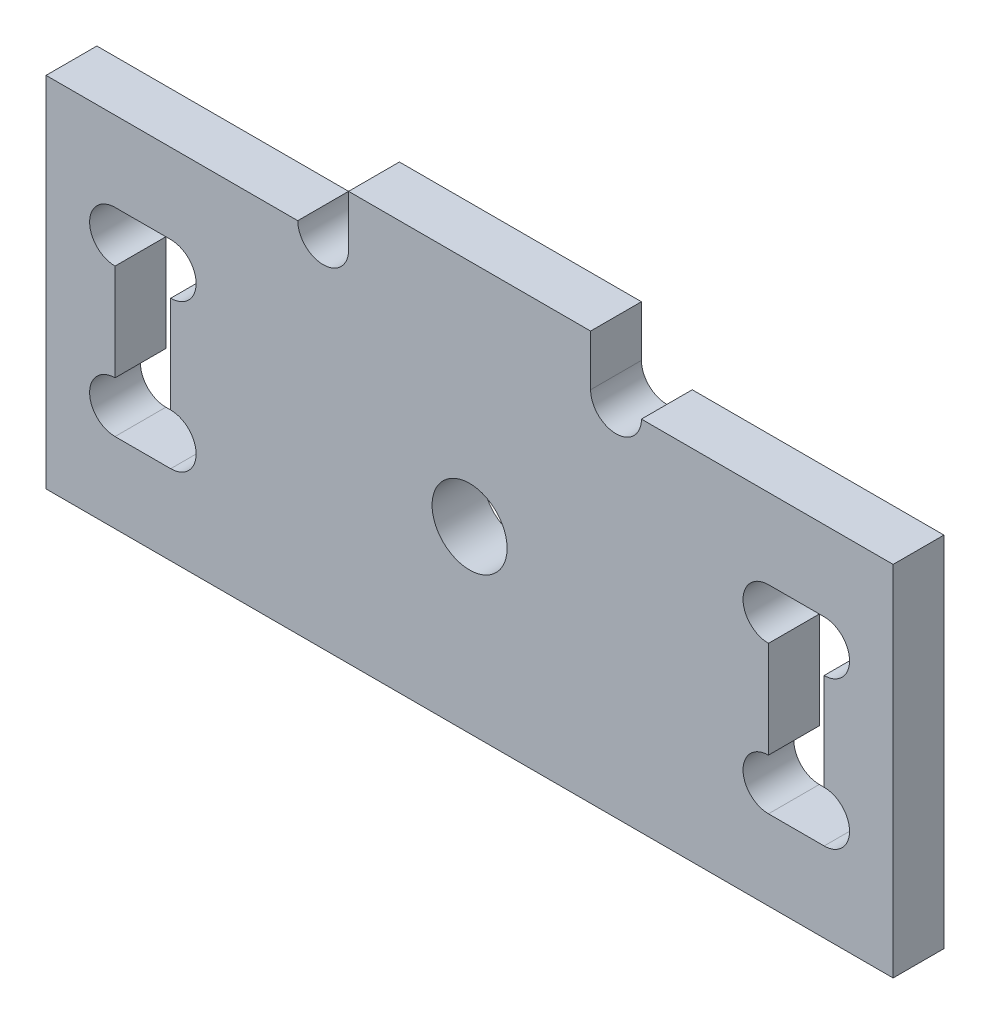
ISO-10303-21;
HEADER;
FILE_DESCRIPTION(('STEP AP214'),'2;1');
FILE_NAME('part.step','',(''),(''),'','','');
FILE_SCHEMA(('AUTOMOTIVE_DESIGN { 1 0 10303 214 1 1 1 1 }'));
ENDSEC;
DATA;
#1=APPLICATION_CONTEXT('core data for automotive mechanical design processes');
#2=APPLICATION_PROTOCOL_DEFINITION('international standard','automotive_design',2000,#1);
#3=PRODUCT_CONTEXT('',#1,'mechanical');
#4=PRODUCT('Part','Part','',(#3));
#5=PRODUCT_RELATED_PRODUCT_CATEGORY('part','',(#4));
#6=PRODUCT_DEFINITION_FORMATION('','',#4);
#7=PRODUCT_DEFINITION_CONTEXT('part definition',#1,'design');
#8=PRODUCT_DEFINITION('design','',#6,#7);
#9=PRODUCT_DEFINITION_SHAPE('','',#8);
#10=(LENGTH_UNIT() NAMED_UNIT(*) SI_UNIT(.MILLI.,.METRE.));
#11=(NAMED_UNIT(*) PLANE_ANGLE_UNIT() SI_UNIT($,.RADIAN.));
#12=(NAMED_UNIT(*) SI_UNIT($,.STERADIAN.) SOLID_ANGLE_UNIT());
#13=UNCERTAINTY_MEASURE_WITH_UNIT(LENGTH_MEASURE(1.E-05),#10,'distance_accuracy_value','');
#14=(GEOMETRIC_REPRESENTATION_CONTEXT(3) GLOBAL_UNCERTAINTY_ASSIGNED_CONTEXT((#13)) GLOBAL_UNIT_ASSIGNED_CONTEXT((#10,
#11,#12)) REPRESENTATION_CONTEXT('',''));
#15=CARTESIAN_POINT('',(0.,0.,0.));
#16=DIRECTION('',(0.,0.,1.));
#17=DIRECTION('',(1.,0.,0.));
#18=AXIS2_PLACEMENT_3D('',#15,#16,#17);
#19=CARTESIAN_POINT('',(12.35,0.,2.1));
#20=DIRECTION('',(-1.,0.,0.));
#21=DIRECTION('',(0.,0.,1.));
#22=AXIS2_PLACEMENT_3D('',#19,#20,#21);
#23=PLANE('',#22);
#24=DIRECTION('',(0.,1.,0.));
#25=VECTOR('',#24,1.);
#26=CARTESIAN_POINT('',(12.35,0.,0.));
#27=LINE('',#26,#25);
#28=CARTESIAN_POINT('',(12.35,-2.,0.));
#29=VERTEX_POINT('',#28);
#30=CARTESIAN_POINT('',(12.35,2.,0.));
#31=VERTEX_POINT('',#30);
#32=EDGE_CURVE('E299',#29,#31,#27,.T.);
#33=ORIENTED_EDGE('',*,*,#32,.T.);
#34=DIRECTION('',(0.,0.,-1.));
#35=VECTOR('',#34,1.);
#36=CARTESIAN_POINT('',(12.35,2.,2.1));
#37=LINE('',#36,#35);
#38=CARTESIAN_POINT('',(12.35,2.,2.1));
#39=VERTEX_POINT('',#38);
#40=EDGE_CURVE('E11',#39,#31,#37,.T.);
#41=ORIENTED_EDGE('',*,*,#40,.F.);
#42=DIRECTION('',(0.,1.,0.));
#43=VECTOR('',#42,1.);
#44=CARTESIAN_POINT('',(12.35,0.,2.1));
#45=LINE('',#44,#43);
#46=CARTESIAN_POINT('',(12.35,-2.,2.1));
#47=VERTEX_POINT('',#46);
#48=EDGE_CURVE('E692',#47,#39,#45,.T.);
#49=ORIENTED_EDGE('',*,*,#48,.F.);
#50=DIRECTION('',(0.,0.,-1.));
#51=VECTOR('',#50,1.);
#52=CARTESIAN_POINT('',(12.35,-2.,2.1));
#53=LINE('',#52,#51);
#54=EDGE_CURVE('E317',#47,#29,#53,.T.);
#55=ORIENTED_EDGE('',*,*,#54,.T.);
#56=EDGE_LOOP('',(#33,#41,#49,#55));
#57=FACE_BOUND('',#56,.T.);
#58=ADVANCED_FACE('F36',(#57),#23,.F.);
#59=CARTESIAN_POINT('',(12.35,3.05,2.1));
#60=DIRECTION('',(0.,0.,-1.));
#61=DIRECTION('',(-1.,0.,0.));
#62=AXIS2_PLACEMENT_3D('',#59,#60,#61);
#63=CYLINDRICAL_SURFACE('',#62,1.05);
#64=CARTESIAN_POINT('',(12.35,3.05,0.));
#65=DIRECTION('',(0.,0.,1.));
#66=DIRECTION('',(1.,0.,0.));
#67=AXIS2_PLACEMENT_3D('',#64,#65,#66);
#68=CIRCLE('',#67,1.05);
#69=CARTESIAN_POINT('',(12.35,4.1,0.));
#70=VERTEX_POINT('',#69);
#71=EDGE_CURVE('E302',#31,#70,#68,.F.);
#72=ORIENTED_EDGE('',*,*,#71,.T.);
#73=DIRECTION('',(0.,0.,-1.));
#74=VECTOR('',#73,1.);
#75=CARTESIAN_POINT('',(12.35,4.1,2.1));
#76=LINE('',#75,#74);
#77=CARTESIAN_POINT('',(12.35,4.1,2.1));
#78=VERTEX_POINT('',#77);
#79=EDGE_CURVE('E46',#78,#70,#76,.T.);
#80=ORIENTED_EDGE('',*,*,#79,.F.);
#81=CARTESIAN_POINT('',(12.35,3.05,2.1));
#82=DIRECTION('',(0.,0.,1.));
#83=DIRECTION('',(1.,0.,0.));
#84=AXIS2_PLACEMENT_3D('',#81,#82,#83);
#85=CIRCLE('',#84,1.05);
#86=EDGE_CURVE('E690',#39,#78,#85,.F.);
#87=ORIENTED_EDGE('',*,*,#86,.F.);
#88=ORIENTED_EDGE('',*,*,#40,.T.);
#89=EDGE_LOOP('',(#72,#80,#87,#88));
#90=FACE_BOUND('',#89,.T.);
#91=ADVANCED_FACE('F425',(#90),#63,.F.);
#92=CARTESIAN_POINT('',(0.,4.1,2.1));
#93=DIRECTION('',(0.,1.,0.));
#94=DIRECTION('',(0.,0.,1.));
#95=AXIS2_PLACEMENT_3D('',#92,#93,#94);
#96=PLANE('',#95);
#97=DIRECTION('',(1.,0.,0.));
#98=VECTOR('',#97,1.);
#99=CARTESIAN_POINT('',(0.,4.1,0.));
#100=LINE('',#99,#98);
#101=CARTESIAN_POINT('',(14.65,4.1,0.));
#102=VERTEX_POINT('',#101);
#103=EDGE_CURVE('E304',#70,#102,#100,.T.);
#104=ORIENTED_EDGE('',*,*,#103,.T.);
#105=DIRECTION('',(0.,0.,-1.));
#106=VECTOR('',#105,1.);
#107=CARTESIAN_POINT('',(14.65,4.1,2.1));
#108=LINE('',#107,#106);
#109=CARTESIAN_POINT('',(14.65,4.1,2.1));
#110=VERTEX_POINT('',#109);
#111=EDGE_CURVE('E324',#110,#102,#108,.T.);
#112=ORIENTED_EDGE('',*,*,#111,.F.);
#113=DIRECTION('',(1.,0.,0.));
#114=VECTOR('',#113,1.);
#115=CARTESIAN_POINT('',(0.,4.1,2.1));
#116=LINE('',#115,#114);
#117=EDGE_CURVE('E686',#78,#110,#116,.T.);
#118=ORIENTED_EDGE('',*,*,#117,.F.);
#119=ORIENTED_EDGE('',*,*,#79,.T.);
#120=EDGE_LOOP('',(#104,#112,#118,#119));
#121=FACE_BOUND('',#120,.T.);
#122=ADVANCED_FACE('F431',(#121),#96,.F.);
#123=CARTESIAN_POINT('',(14.65,3.05,2.1));
#124=DIRECTION('',(0.,0.,-1.));
#125=DIRECTION('',(-1.,0.,0.));
#126=AXIS2_PLACEMENT_3D('',#123,#124,#125);
#127=CYLINDRICAL_SURFACE('',#126,1.05);
#128=CARTESIAN_POINT('',(14.65,3.05,0.));
#129=DIRECTION('',(0.,0.,1.));
#130=DIRECTION('',(1.,0.,0.));
#131=AXIS2_PLACEMENT_3D('',#128,#129,#130);
#132=CIRCLE('',#131,1.05);
#133=CARTESIAN_POINT('',(14.65,2.,0.));
#134=VERTEX_POINT('',#133);
#135=EDGE_CURVE('E306',#102,#134,#132,.F.);
#136=ORIENTED_EDGE('',*,*,#135,.T.);
#137=DIRECTION('',(0.,0.,-1.));
#138=VECTOR('',#137,1.);
#139=CARTESIAN_POINT('',(14.65,2.,2.1));
#140=LINE('',#139,#138);
#141=CARTESIAN_POINT('',(14.65,2.,2.1));
#142=VERTEX_POINT('',#141);
#143=EDGE_CURVE('E322',#142,#134,#140,.T.);
#144=ORIENTED_EDGE('',*,*,#143,.F.);
#145=CARTESIAN_POINT('',(14.65,3.05,2.1));
#146=DIRECTION('',(0.,0.,1.));
#147=DIRECTION('',(1.,0.,0.));
#148=AXIS2_PLACEMENT_3D('',#145,#146,#147);
#149=CIRCLE('',#148,1.05);
#150=EDGE_CURVE('E683',#110,#142,#149,.F.);
#151=ORIENTED_EDGE('',*,*,#150,.F.);
#152=ORIENTED_EDGE('',*,*,#111,.T.);
#153=EDGE_LOOP('',(#136,#144,#151,#152));
#154=FACE_BOUND('',#153,.T.);
#155=ADVANCED_FACE('F633',(#154),#127,.F.);
#156=CARTESIAN_POINT('',(14.65,0.,2.1));
#157=DIRECTION('',(-1.,0.,0.));
#158=DIRECTION('',(0.,0.,1.));
#159=AXIS2_PLACEMENT_3D('',#156,#157,#158);
#160=PLANE('',#159);
#161=DIRECTION('',(0.,1.,0.));
#162=VECTOR('',#161,1.);
#163=CARTESIAN_POINT('',(14.65,0.,0.));
#164=LINE('',#163,#162);
#165=CARTESIAN_POINT('',(14.65,-2.,0.));
#166=VERTEX_POINT('',#165);
#167=EDGE_CURVE('E309',#166,#134,#164,.T.);
#168=ORIENTED_EDGE('',*,*,#167,.F.);
#169=DIRECTION('',(0.,0.,-1.));
#170=VECTOR('',#169,1.);
#171=CARTESIAN_POINT('',(14.65,-2.,2.1));
#172=LINE('',#171,#170);
#173=CARTESIAN_POINT('',(14.65,-2.,2.1));
#174=VERTEX_POINT('',#173);
#175=EDGE_CURVE('E234',#174,#166,#172,.T.);
#176=ORIENTED_EDGE('',*,*,#175,.F.);
#177=DIRECTION('',(0.,1.,0.));
#178=VECTOR('',#177,1.);
#179=CARTESIAN_POINT('',(14.65,0.,2.1));
#180=LINE('',#179,#178);
#181=EDGE_CURVE('E223',#174,#142,#180,.T.);
#182=ORIENTED_EDGE('',*,*,#181,.T.);
#183=ORIENTED_EDGE('',*,*,#143,.T.);
#184=EDGE_LOOP('',(#168,#176,#182,#183));
#185=FACE_BOUND('',#184,.T.);
#186=ADVANCED_FACE('F625',(#185),#160,.T.);
#187=CARTESIAN_POINT('',(14.65,-3.05,2.1));
#188=DIRECTION('',(0.,0.,-1.));
#189=DIRECTION('',(-1.,0.,0.));
#190=AXIS2_PLACEMENT_3D('',#187,#188,#189);
#191=CYLINDRICAL_SURFACE('',#190,1.05);
#192=CARTESIAN_POINT('',(14.65,-3.05,0.));
#193=DIRECTION('',(0.,0.,1.));
#194=DIRECTION('',(1.,0.,0.));
#195=AXIS2_PLACEMENT_3D('',#192,#193,#194);
#196=CIRCLE('',#195,1.05);
#197=CARTESIAN_POINT('',(14.65,-4.1,0.));
#198=VERTEX_POINT('',#197);
#199=EDGE_CURVE('E230',#166,#198,#196,.F.);
#200=ORIENTED_EDGE('',*,*,#199,.T.);
#201=DIRECTION('',(0.,0.,-1.));
#202=VECTOR('',#201,1.);
#203=CARTESIAN_POINT('',(14.65,-4.1,2.1));
#204=LINE('',#203,#202);
#205=CARTESIAN_POINT('',(14.65,-4.1,2.1));
#206=VERTEX_POINT('',#205);
#207=EDGE_CURVE('E227',#206,#198,#204,.T.);
#208=ORIENTED_EDGE('',*,*,#207,.F.);
#209=CARTESIAN_POINT('',(14.65,-3.05,2.1));
#210=DIRECTION('',(0.,0.,1.));
#211=DIRECTION('',(1.,0.,0.));
#212=AXIS2_PLACEMENT_3D('',#209,#210,#211);
#213=CIRCLE('',#212,1.05);
#214=EDGE_CURVE('E217',#174,#206,#213,.F.);
#215=ORIENTED_EDGE('',*,*,#214,.F.);
#216=ORIENTED_EDGE('',*,*,#175,.T.);
#217=EDGE_LOOP('',(#200,#208,#215,#216));
#218=FACE_BOUND('',#217,.T.);
#219=ADVANCED_FACE('F228',(#218),#191,.F.);
#220=CARTESIAN_POINT('',(0.,-4.1,2.1));
#221=DIRECTION('',(0.,1.,0.));
#222=DIRECTION('',(0.,0.,1.));
#223=AXIS2_PLACEMENT_3D('',#220,#221,#222);
#224=PLANE('',#223);
#225=DIRECTION('',(1.,0.,0.));
#226=VECTOR('',#225,1.);
#227=CARTESIAN_POINT('',(0.,-4.1,0.));
#228=LINE('',#227,#226);
#229=CARTESIAN_POINT('',(12.35,-4.1,0.));
#230=VERTEX_POINT('',#229);
#231=EDGE_CURVE('E313',#230,#198,#228,.T.);
#232=ORIENTED_EDGE('',*,*,#231,.F.);
#233=DIRECTION('',(0.,0.,-1.));
#234=VECTOR('',#233,1.);
#235=CARTESIAN_POINT('',(12.35,-4.1,2.1));
#236=LINE('',#235,#234);
#237=CARTESIAN_POINT('',(12.35,-4.1,2.1));
#238=VERTEX_POINT('',#237);
#239=EDGE_CURVE('E137',#238,#230,#236,.T.);
#240=ORIENTED_EDGE('',*,*,#239,.F.);
#241=DIRECTION('',(1.,0.,0.));
#242=VECTOR('',#241,1.);
#243=CARTESIAN_POINT('',(0.,-4.1,2.1));
#244=LINE('',#243,#242);
#245=EDGE_CURVE('E221',#238,#206,#244,.T.);
#246=ORIENTED_EDGE('',*,*,#245,.T.);
#247=ORIENTED_EDGE('',*,*,#207,.T.);
#248=EDGE_LOOP('',(#232,#240,#246,#247));
#249=FACE_BOUND('',#248,.T.);
#250=ADVANCED_FACE('F236',(#249),#224,.T.);
#251=CARTESIAN_POINT('',(-12.35,-3.05,2.1));
#252=DIRECTION('',(0.,0.,-1.));
#253=DIRECTION('',(-1.,0.,0.));
#254=AXIS2_PLACEMENT_3D('',#251,#252,#253);
#255=CYLINDRICAL_SURFACE('',#254,1.05);
#256=CARTESIAN_POINT('',(-12.35,-3.05,0.));
#257=DIRECTION('',(0.,0.,1.));
#258=DIRECTION('',(1.,0.,0.));
#259=AXIS2_PLACEMENT_3D('',#256,#257,#258);
#260=CIRCLE('',#259,1.05);
#261=CARTESIAN_POINT('',(-12.35,-4.1,0.));
#262=VERTEX_POINT('',#261);
#263=CARTESIAN_POINT('',(-12.35,-2.,0.));
#264=VERTEX_POINT('',#263);
#265=EDGE_CURVE('E275',#262,#264,#260,.T.);
#266=ORIENTED_EDGE('',*,*,#265,.F.);
#267=DIRECTION('',(0.,0.,-1.));
#268=VECTOR('',#267,1.);
#269=CARTESIAN_POINT('',(-12.35,-4.1,2.1));
#270=LINE('',#269,#268);
#271=CARTESIAN_POINT('',(-12.35,-4.1,2.1));
#272=VERTEX_POINT('',#271);
#273=EDGE_CURVE('E319',#272,#262,#270,.T.);
#274=ORIENTED_EDGE('',*,*,#273,.F.);
#275=CARTESIAN_POINT('',(-12.35,-3.05,2.1));
#276=DIRECTION('',(0.,0.,1.));
#277=DIRECTION('',(1.,0.,0.));
#278=AXIS2_PLACEMENT_3D('',#275,#276,#277);
#279=CIRCLE('',#278,1.05);
#280=CARTESIAN_POINT('',(-12.35,-2.,2.1));
#281=VERTEX_POINT('',#280);
#282=EDGE_CURVE('E713',#272,#281,#279,.T.);
#283=ORIENTED_EDGE('',*,*,#282,.T.);
#284=DIRECTION('',(0.,0.,-1.));
#285=VECTOR('',#284,1.);
#286=CARTESIAN_POINT('',(-12.35,-2.,2.1));
#287=LINE('',#286,#285);
#288=EDGE_CURVE('E329',#281,#264,#287,.T.);
#289=ORIENTED_EDGE('',*,*,#288,.T.);
#290=EDGE_LOOP('',(#266,#274,#283,#289));
#291=FACE_BOUND('',#290,.T.);
#292=ADVANCED_FACE('F463',(#291),#255,.F.);
#293=CARTESIAN_POINT('',(0.,-4.1,2.1));
#294=DIRECTION('',(0.,-1.,0.));
#295=DIRECTION('',(0.,0.,-1.));
#296=AXIS2_PLACEMENT_3D('',#293,#294,#295);
#297=PLANE('',#296);
#298=DIRECTION('',(-1.,0.,0.));
#299=VECTOR('',#298,1.);
#300=CARTESIAN_POINT('',(0.,-4.1,0.));
#301=LINE('',#300,#299);
#302=CARTESIAN_POINT('',(-14.65,-4.1,0.));
#303=VERTEX_POINT('',#302);
#304=EDGE_CURVE('E278',#262,#303,#301,.T.);
#305=ORIENTED_EDGE('',*,*,#304,.T.);
#306=DIRECTION('',(0.,0.,-1.));
#307=VECTOR('',#306,1.);
#308=CARTESIAN_POINT('',(-14.65,-4.1,2.1));
#309=LINE('',#308,#307);
#310=CARTESIAN_POINT('',(-14.65,-4.1,2.1));
#311=VERTEX_POINT('',#310);
#312=EDGE_CURVE('E341',#311,#303,#309,.T.);
#313=ORIENTED_EDGE('',*,*,#312,.F.);
#314=DIRECTION('',(-1.,0.,0.));
#315=VECTOR('',#314,1.);
#316=CARTESIAN_POINT('',(0.,-4.1,2.1));
#317=LINE('',#316,#315);
#318=EDGE_CURVE('E711',#272,#311,#317,.T.);
#319=ORIENTED_EDGE('',*,*,#318,.F.);
#320=ORIENTED_EDGE('',*,*,#273,.T.);
#321=EDGE_LOOP('',(#305,#313,#319,#320));
#322=FACE_BOUND('',#321,.T.);
#323=ADVANCED_FACE('F459',(#322),#297,.F.);
#324=CARTESIAN_POINT('',(-14.65,-3.05,2.1));
#325=DIRECTION('',(0.,0.,-1.));
#326=DIRECTION('',(-1.,0.,0.));
#327=AXIS2_PLACEMENT_3D('',#324,#325,#326);
#328=CYLINDRICAL_SURFACE('',#327,1.05);
#329=CARTESIAN_POINT('',(-14.65,-3.05,0.));
#330=DIRECTION('',(0.,0.,1.));
#331=DIRECTION('',(1.,0.,0.));
#332=AXIS2_PLACEMENT_3D('',#329,#330,#331);
#333=CIRCLE('',#332,1.05);
#334=CARTESIAN_POINT('',(-14.65,-2.,0.));
#335=VERTEX_POINT('',#334);
#336=EDGE_CURVE('E281',#335,#303,#333,.T.);
#337=ORIENTED_EDGE('',*,*,#336,.F.);
#338=DIRECTION('',(0.,0.,-1.));
#339=VECTOR('',#338,1.);
#340=CARTESIAN_POINT('',(-14.65,-2.,2.1));
#341=LINE('',#340,#339);
#342=CARTESIAN_POINT('',(-14.65,-2.,2.1));
#343=VERTEX_POINT('',#342);
#344=EDGE_CURVE('E339',#343,#335,#341,.T.);
#345=ORIENTED_EDGE('',*,*,#344,.F.);
#346=CARTESIAN_POINT('',(-14.65,-3.05,2.1));
#347=DIRECTION('',(0.,0.,1.));
#348=DIRECTION('',(1.,0.,0.));
#349=AXIS2_PLACEMENT_3D('',#346,#347,#348);
#350=CIRCLE('',#349,1.05);
#351=EDGE_CURVE('E708',#343,#311,#350,.T.);
#352=ORIENTED_EDGE('',*,*,#351,.T.);
#353=ORIENTED_EDGE('',*,*,#312,.T.);
#354=EDGE_LOOP('',(#337,#345,#352,#353));
#355=FACE_BOUND('',#354,.T.);
#356=ADVANCED_FACE('F455',(#355),#328,.F.);
#357=CARTESIAN_POINT('',(-14.65,0.,2.1));
#358=DIRECTION('',(-1.,0.,0.));
#359=DIRECTION('',(0.,0.,1.));
#360=AXIS2_PLACEMENT_3D('',#357,#358,#359);
#361=PLANE('',#360);
#362=DIRECTION('',(0.,1.,0.));
#363=VECTOR('',#362,1.);
#364=CARTESIAN_POINT('',(-14.65,0.,0.));
#365=LINE('',#364,#363);
#366=CARTESIAN_POINT('',(-14.65,2.,0.));
#367=VERTEX_POINT('',#366);
#368=EDGE_CURVE('E284',#335,#367,#365,.T.);
#369=ORIENTED_EDGE('',*,*,#368,.T.);
#370=DIRECTION('',(0.,0.,-1.));
#371=VECTOR('',#370,1.);
#372=CARTESIAN_POINT('',(-14.65,2.,2.1));
#373=LINE('',#372,#371);
#374=CARTESIAN_POINT('',(-14.65,2.,2.1));
#375=VERTEX_POINT('',#374);
#376=EDGE_CURVE('E337',#375,#367,#373,.T.);
#377=ORIENTED_EDGE('',*,*,#376,.F.);
#378=DIRECTION('',(0.,1.,0.));
#379=VECTOR('',#378,1.);
#380=CARTESIAN_POINT('',(-14.65,0.,2.1));
#381=LINE('',#380,#379);
#382=EDGE_CURVE('E706',#343,#375,#381,.T.);
#383=ORIENTED_EDGE('',*,*,#382,.F.);
#384=ORIENTED_EDGE('',*,*,#344,.T.);
#385=EDGE_LOOP('',(#369,#377,#383,#384));
#386=FACE_BOUND('',#385,.T.);
#387=ADVANCED_FACE('F451',(#386),#361,.F.);
#388=CARTESIAN_POINT('',(-14.65,3.05,2.1));
#389=DIRECTION('',(0.,0.,-1.));
#390=DIRECTION('',(-1.,0.,0.));
#391=AXIS2_PLACEMENT_3D('',#388,#389,#390);
#392=CYLINDRICAL_SURFACE('',#391,1.05);
#393=CARTESIAN_POINT('',(-14.65,3.05,0.));
#394=DIRECTION('',(0.,0.,1.));
#395=DIRECTION('',(1.,0.,0.));
#396=AXIS2_PLACEMENT_3D('',#393,#394,#395);
#397=CIRCLE('',#396,1.05);
#398=CARTESIAN_POINT('',(-14.65,4.1,0.));
#399=VERTEX_POINT('',#398);
#400=EDGE_CURVE('E287',#399,#367,#397,.T.);
#401=ORIENTED_EDGE('',*,*,#400,.F.);
#402=DIRECTION('',(0.,0.,-1.));
#403=VECTOR('',#402,1.);
#404=CARTESIAN_POINT('',(-14.65,4.1,2.1));
#405=LINE('',#404,#403);
#406=CARTESIAN_POINT('',(-14.65,4.1,2.1));
#407=VERTEX_POINT('',#406);
#408=EDGE_CURVE('E335',#407,#399,#405,.T.);
#409=ORIENTED_EDGE('',*,*,#408,.F.);
#410=CARTESIAN_POINT('',(-14.65,3.05,2.1));
#411=DIRECTION('',(0.,0.,1.));
#412=DIRECTION('',(1.,0.,0.));
#413=AXIS2_PLACEMENT_3D('',#410,#411,#412);
#414=CIRCLE('',#413,1.05);
#415=EDGE_CURVE('E703',#407,#375,#414,.T.);
#416=ORIENTED_EDGE('',*,*,#415,.T.);
#417=ORIENTED_EDGE('',*,*,#376,.T.);
#418=EDGE_LOOP('',(#401,#409,#416,#417));
#419=FACE_BOUND('',#418,.T.);
#420=ADVANCED_FACE('F447',(#419),#392,.F.);
#421=CARTESIAN_POINT('',(0.,4.1,2.1));
#422=DIRECTION('',(0.,-1.,0.));
#423=DIRECTION('',(0.,0.,-1.));
#424=AXIS2_PLACEMENT_3D('',#421,#422,#423);
#425=PLANE('',#424);
#426=DIRECTION('',(-1.,0.,0.));
#427=VECTOR('',#426,1.);
#428=CARTESIAN_POINT('',(0.,4.1,0.));
#429=LINE('',#428,#427);
#430=CARTESIAN_POINT('',(-12.35,4.1,0.));
#431=VERTEX_POINT('',#430);
#432=EDGE_CURVE('E290',#431,#399,#429,.T.);
#433=ORIENTED_EDGE('',*,*,#432,.F.);
#434=DIRECTION('',(0.,0.,-1.));
#435=VECTOR('',#434,1.);
#436=CARTESIAN_POINT('',(-12.35,4.1,2.1));
#437=LINE('',#436,#435);
#438=CARTESIAN_POINT('',(-12.35,4.1,2.1));
#439=VERTEX_POINT('',#438);
#440=EDGE_CURVE('E333',#439,#431,#437,.T.);
#441=ORIENTED_EDGE('',*,*,#440,.F.);
#442=DIRECTION('',(-1.,0.,0.));
#443=VECTOR('',#442,1.);
#444=CARTESIAN_POINT('',(0.,4.1,2.1));
#445=LINE('',#444,#443);
#446=EDGE_CURVE('E700',#439,#407,#445,.T.);
#447=ORIENTED_EDGE('',*,*,#446,.T.);
#448=ORIENTED_EDGE('',*,*,#408,.T.);
#449=EDGE_LOOP('',(#433,#441,#447,#448));
#450=FACE_BOUND('',#449,.T.);
#451=ADVANCED_FACE('F443',(#450),#425,.T.);
#452=CARTESIAN_POINT('',(-12.35,3.05,2.1));
#453=DIRECTION('',(0.,0.,-1.));
#454=DIRECTION('',(-1.,0.,0.));
#455=AXIS2_PLACEMENT_3D('',#452,#453,#454);
#456=CYLINDRICAL_SURFACE('',#455,1.05);
#457=CARTESIAN_POINT('',(-12.35,3.05,0.));
#458=DIRECTION('',(0.,0.,1.));
#459=DIRECTION('',(1.,0.,0.));
#460=AXIS2_PLACEMENT_3D('',#457,#458,#459);
#461=CIRCLE('',#460,1.05);
#462=CARTESIAN_POINT('',(-12.35,2.,0.));
#463=VERTEX_POINT('',#462);
#464=EDGE_CURVE('E293',#463,#431,#461,.T.);
#465=ORIENTED_EDGE('',*,*,#464,.F.);
#466=DIRECTION('',(0.,0.,-1.));
#467=VECTOR('',#466,1.);
#468=CARTESIAN_POINT('',(-12.35,2.,2.1));
#469=LINE('',#468,#467);
#470=CARTESIAN_POINT('',(-12.35,2.,2.1));
#471=VERTEX_POINT('',#470);
#472=EDGE_CURVE('E331',#471,#463,#469,.T.);
#473=ORIENTED_EDGE('',*,*,#472,.F.);
#474=CARTESIAN_POINT('',(-12.35,3.05,2.1));
#475=DIRECTION('',(0.,0.,1.));
#476=DIRECTION('',(1.,0.,0.));
#477=AXIS2_PLACEMENT_3D('',#474,#475,#476);
#478=CIRCLE('',#477,1.05);
#479=EDGE_CURVE('E697',#471,#439,#478,.T.);
#480=ORIENTED_EDGE('',*,*,#479,.T.);
#481=ORIENTED_EDGE('',*,*,#440,.T.);
#482=EDGE_LOOP('',(#465,#473,#480,#481));
#483=FACE_BOUND('',#482,.T.);
#484=ADVANCED_FACE('F440',(#483),#456,.F.);
#485=CARTESIAN_POINT('',(-6.05,7.4,2.1));
#486=DIRECTION('',(0.,0.,-1.));
#487=DIRECTION('',(-1.,0.,0.));
#488=AXIS2_PLACEMENT_3D('',#485,#486,#487);
#489=CYLINDRICAL_SURFACE('',#488,1.05);
#490=CARTESIAN_POINT('',(-6.05,7.4,0.));
#491=DIRECTION('',(0.,0.,1.));
#492=DIRECTION('',(1.,0.,0.));
#493=AXIS2_PLACEMENT_3D('',#490,#491,#492);
#494=CIRCLE('',#493,1.05);
#495=CARTESIAN_POINT('',(-7.1,7.4,0.));
#496=VERTEX_POINT('',#495);
#497=CARTESIAN_POINT('',(-5.,7.4,0.));
#498=VERTEX_POINT('',#497);
#499=EDGE_CURVE('E245',#496,#498,#494,.T.);
#500=ORIENTED_EDGE('',*,*,#499,.F.);
#501=DIRECTION('',(0.,0.,-1.));
#502=VECTOR('',#501,1.);
#503=CARTESIAN_POINT('',(-7.1,7.4,2.1));
#504=LINE('',#503,#502);
#505=CARTESIAN_POINT('',(-7.1,7.4,2.1));
#506=VERTEX_POINT('',#505);
#507=EDGE_CURVE('E40',#506,#496,#504,.T.);
#508=ORIENTED_EDGE('',*,*,#507,.F.);
#509=CARTESIAN_POINT('',(-6.05,7.4,2.1));
#510=DIRECTION('',(0.,0.,1.));
#511=DIRECTION('',(1.,0.,0.));
#512=AXIS2_PLACEMENT_3D('',#509,#510,#511);
#513=CIRCLE('',#512,1.05);
#514=CARTESIAN_POINT('',(-5.,7.4,2.1));
#515=VERTEX_POINT('',#514);
#516=EDGE_CURVE('E374',#506,#515,#513,.T.);
#517=ORIENTED_EDGE('',*,*,#516,.T.);
#518=DIRECTION('',(0.,0.,-1.));
#519=VECTOR('',#518,1.);
#520=CARTESIAN_POINT('',(-5.,7.4,2.1));
#521=LINE('',#520,#519);
#522=EDGE_CURVE('E238',#515,#498,#521,.T.);
#523=ORIENTED_EDGE('',*,*,#522,.T.);
#524=EDGE_LOOP('',(#500,#508,#517,#523));
#525=FACE_BOUND('',#524,.T.);
#526=ADVANCED_FACE('F373',(#525),#489,.F.);
#527=CARTESIAN_POINT('',(0.,7.4,2.1));
#528=DIRECTION('',(0.,-1.,0.));
#529=DIRECTION('',(1.,0.,0.));
#530=AXIS2_PLACEMENT_3D('',#527,#528,#529);
#531=PLANE('',#530);
#532=DIRECTION('',(-1.,0.,0.));
#533=VECTOR('',#532,1.);
#534=CARTESIAN_POINT('',(0.,7.4,0.));
#535=LINE('',#534,#533);
#536=CARTESIAN_POINT('',(-17.5,7.4,0.));
#537=VERTEX_POINT('',#536);
#538=EDGE_CURVE('E248',#496,#537,#535,.T.);
#539=ORIENTED_EDGE('',*,*,#538,.T.);
#540=DIRECTION('',(0.,0.,-1.));
#541=VECTOR('',#540,1.);
#542=CARTESIAN_POINT('',(-17.5,7.4,2.1));
#543=LINE('',#542,#541);
#544=CARTESIAN_POINT('',(-17.5,7.4,2.1));
#545=VERTEX_POINT('',#544);
#546=EDGE_CURVE('E359',#545,#537,#543,.T.);
#547=ORIENTED_EDGE('',*,*,#546,.F.);
#548=DIRECTION('',(-1.,0.,0.));
#549=VECTOR('',#548,1.);
#550=CARTESIAN_POINT('',(0.,7.4,2.1));
#551=LINE('',#550,#549);
#552=EDGE_CURVE('E367',#506,#545,#551,.T.);
#553=ORIENTED_EDGE('',*,*,#552,.F.);
#554=ORIENTED_EDGE('',*,*,#507,.T.);
#555=EDGE_LOOP('',(#539,#547,#553,#554));
#556=FACE_BOUND('',#555,.T.);
#557=ADVANCED_FACE('F366',(#556),#531,.F.);
#558=CARTESIAN_POINT('',(-17.5,0.,2.1));
#559=DIRECTION('',(-1.,0.,0.));
#560=DIRECTION('',(0.,0.,1.));
#561=AXIS2_PLACEMENT_3D('',#558,#559,#560);
#562=PLANE('',#561);
#563=DIRECTION('',(0.,1.,0.));
#564=VECTOR('',#563,1.);
#565=CARTESIAN_POINT('',(-17.5,0.,0.));
#566=LINE('',#565,#564);
#567=CARTESIAN_POINT('',(-17.5,-7.4,0.));
#568=VERTEX_POINT('',#567);
#569=EDGE_CURVE('E251',#568,#537,#566,.T.);
#570=ORIENTED_EDGE('',*,*,#569,.F.);
#571=DIRECTION('',(0.,0.,-1.));
#572=VECTOR('',#571,1.);
#573=CARTESIAN_POINT('',(-17.5,-7.4,2.1));
#574=LINE('',#573,#572);
#575=CARTESIAN_POINT('',(-17.5,-7.4,2.1));
#576=VERTEX_POINT('',#575);
#577=EDGE_CURVE('E358',#576,#568,#574,.T.);
#578=ORIENTED_EDGE('',*,*,#577,.F.);
#579=DIRECTION('',(0.,1.,0.));
#580=VECTOR('',#579,1.);
#581=CARTESIAN_POINT('',(-17.5,0.,2.1));
#582=LINE('',#581,#580);
#583=EDGE_CURVE('E724',#576,#545,#582,.T.);
#584=ORIENTED_EDGE('',*,*,#583,.T.);
#585=ORIENTED_EDGE('',*,*,#546,.T.);
#586=EDGE_LOOP('',(#570,#578,#584,#585));
#587=FACE_BOUND('',#586,.T.);
#588=ADVANCED_FACE('F415',(#587),#562,.T.);
#589=CARTESIAN_POINT('',(0.,-7.4,2.1));
#590=DIRECTION('',(0.,-1.,0.));
#591=DIRECTION('',(1.,0.,0.));
#592=AXIS2_PLACEMENT_3D('',#589,#590,#591);
#593=PLANE('',#592);
#594=DIRECTION('',(-1.,0.,0.));
#595=VECTOR('',#594,1.);
#596=CARTESIAN_POINT('',(0.,-7.4,0.));
#597=LINE('',#596,#595);
#598=CARTESIAN_POINT('',(17.5,-7.4,0.));
#599=VERTEX_POINT('',#598);
#600=EDGE_CURVE('E254',#599,#568,#597,.T.);
#601=ORIENTED_EDGE('',*,*,#600,.F.);
#602=DIRECTION('',(0.,0.,-1.));
#603=VECTOR('',#602,1.);
#604=CARTESIAN_POINT('',(17.5,-7.4,2.1));
#605=LINE('',#604,#603);
#606=CARTESIAN_POINT('',(17.5,-7.4,2.1));
#607=VERTEX_POINT('',#606);
#608=EDGE_CURVE('E356',#607,#599,#605,.T.);
#609=ORIENTED_EDGE('',*,*,#608,.F.);
#610=DIRECTION('',(-1.,0.,0.));
#611=VECTOR('',#610,1.);
#612=CARTESIAN_POINT('',(0.,-7.4,2.1));
#613=LINE('',#612,#611);
#614=EDGE_CURVE('E413',#607,#576,#613,.T.);
#615=ORIENTED_EDGE('',*,*,#614,.T.);
#616=ORIENTED_EDGE('',*,*,#577,.T.);
#617=EDGE_LOOP('',(#601,#609,#615,#616));
#618=FACE_BOUND('',#617,.T.);
#619=ADVANCED_FACE('F412',(#618),#593,.T.);
#620=CARTESIAN_POINT('',(17.5,0.,2.1));
#621=DIRECTION('',(-1.,0.,0.));
#622=DIRECTION('',(0.,0.,1.));
#623=AXIS2_PLACEMENT_3D('',#620,#621,#622);
#624=PLANE('',#623);
#625=DIRECTION('',(0.,1.,0.));
#626=VECTOR('',#625,1.);
#627=CARTESIAN_POINT('',(17.5,0.,0.));
#628=LINE('',#627,#626);
#629=CARTESIAN_POINT('',(17.5,7.4,0.));
#630=VERTEX_POINT('',#629);
#631=EDGE_CURVE('E257',#599,#630,#628,.T.);
#632=ORIENTED_EDGE('',*,*,#631,.T.);
#633=DIRECTION('',(0.,0.,-1.));
#634=VECTOR('',#633,1.);
#635=CARTESIAN_POINT('',(17.5,7.4,2.1));
#636=LINE('',#635,#634);
#637=CARTESIAN_POINT('',(17.5,7.4,2.1));
#638=VERTEX_POINT('',#637);
#639=EDGE_CURVE('E353',#638,#630,#636,.T.);
#640=ORIENTED_EDGE('',*,*,#639,.F.);
#641=DIRECTION('',(0.,1.,0.));
#642=VECTOR('',#641,1.);
#643=CARTESIAN_POINT('',(17.5,0.,2.1));
#644=LINE('',#643,#642);
#645=EDGE_CURVE('E408',#607,#638,#644,.T.);
#646=ORIENTED_EDGE('',*,*,#645,.F.);
#647=ORIENTED_EDGE('',*,*,#608,.T.);
#648=EDGE_LOOP('',(#632,#640,#646,#647));
#649=FACE_BOUND('',#648,.T.);
#650=ADVANCED_FACE('F407',(#649),#624,.F.);
#651=CARTESIAN_POINT('',(0.,7.4,2.1));
#652=DIRECTION('',(0.,-1.,0.));
#653=DIRECTION('',(1.,0.,0.));
#654=AXIS2_PLACEMENT_3D('',#651,#652,#653);
#655=PLANE('',#654);
#656=DIRECTION('',(-1.,0.,0.));
#657=VECTOR('',#656,1.);
#658=CARTESIAN_POINT('',(0.,7.4,0.));
#659=LINE('',#658,#657);
#660=CARTESIAN_POINT('',(7.1,7.4,0.));
#661=VERTEX_POINT('',#660);
#662=EDGE_CURVE('E260',#630,#661,#659,.T.);
#663=ORIENTED_EDGE('',*,*,#662,.T.);
#664=DIRECTION('',(0.,0.,-1.));
#665=VECTOR('',#664,1.);
#666=CARTESIAN_POINT('',(7.1,7.4,2.1));
#667=LINE('',#666,#665);
#668=CARTESIAN_POINT('',(7.1,7.4,2.1));
#669=VERTEX_POINT('',#668);
#670=EDGE_CURVE('E351',#669,#661,#667,.T.);
#671=ORIENTED_EDGE('',*,*,#670,.F.);
#672=DIRECTION('',(-1.,0.,0.));
#673=VECTOR('',#672,1.);
#674=CARTESIAN_POINT('',(0.,7.4,2.1));
#675=LINE('',#674,#673);
#676=EDGE_CURVE('E403',#638,#669,#675,.T.);
#677=ORIENTED_EDGE('',*,*,#676,.F.);
#678=ORIENTED_EDGE('',*,*,#639,.T.);
#679=EDGE_LOOP('',(#663,#671,#677,#678));
#680=FACE_BOUND('',#679,.T.);
#681=ADVANCED_FACE('F402',(#680),#655,.F.);
#682=CARTESIAN_POINT('',(6.05,7.4,2.1));
#683=DIRECTION('',(0.,0.,-1.));
#684=DIRECTION('',(-1.,0.,0.));
#685=AXIS2_PLACEMENT_3D('',#682,#683,#684);
#686=CYLINDRICAL_SURFACE('',#685,1.05);
#687=CARTESIAN_POINT('',(6.05,7.4,0.));
#688=DIRECTION('',(0.,0.,1.));
#689=DIRECTION('',(1.,0.,0.));
#690=AXIS2_PLACEMENT_3D('',#687,#688,#689);
#691=CIRCLE('',#690,1.05);
#692=CARTESIAN_POINT('',(5.,7.4,0.));
#693=VERTEX_POINT('',#692);
#694=EDGE_CURVE('E263',#693,#661,#691,.T.);
#695=ORIENTED_EDGE('',*,*,#694,.F.);
#696=DIRECTION('',(0.,0.,-1.));
#697=VECTOR('',#696,1.);
#698=CARTESIAN_POINT('',(5.,7.4,2.1));
#699=LINE('',#698,#697);
#700=CARTESIAN_POINT('',(5.,7.4,2.1));
#701=VERTEX_POINT('',#700);
#702=EDGE_CURVE('E349',#701,#693,#699,.T.);
#703=ORIENTED_EDGE('',*,*,#702,.F.);
#704=CARTESIAN_POINT('',(6.05,7.4,2.1));
#705=DIRECTION('',(0.,0.,1.));
#706=DIRECTION('',(1.,0.,0.));
#707=AXIS2_PLACEMENT_3D('',#704,#705,#706);
#708=CIRCLE('',#707,1.05);
#709=EDGE_CURVE('E719',#701,#669,#708,.T.);
#710=ORIENTED_EDGE('',*,*,#709,.T.);
#711=ORIENTED_EDGE('',*,*,#670,.T.);
#712=EDGE_LOOP('',(#695,#703,#710,#711));
#713=FACE_BOUND('',#712,.T.);
#714=ADVANCED_FACE('F396',(#713),#686,.F.);
#715=CARTESIAN_POINT('',(5.,0.,2.1));
#716=DIRECTION('',(1.,0.,0.));
#717=DIRECTION('',(0.,0.,-1.));
#718=AXIS2_PLACEMENT_3D('',#715,#716,#717);
#719=PLANE('',#718);
#720=DIRECTION('',(0.,-1.,0.));
#721=VECTOR('',#720,1.);
#722=CARTESIAN_POINT('',(5.,0.,0.));
#723=LINE('',#722,#721);
#724=CARTESIAN_POINT('',(5.,9.5,0.));
#725=VERTEX_POINT('',#724);
#726=EDGE_CURVE('E266',#725,#693,#723,.T.);
#727=ORIENTED_EDGE('',*,*,#726,.F.);
#728=DIRECTION('',(0.,0.,-1.));
#729=VECTOR('',#728,1.);
#730=CARTESIAN_POINT('',(5.,9.5,2.1));
#731=LINE('',#730,#729);
#732=CARTESIAN_POINT('',(5.,9.5,2.1));
#733=VERTEX_POINT('',#732);
#734=EDGE_CURVE('E347',#733,#725,#731,.T.);
#735=ORIENTED_EDGE('',*,*,#734,.F.);
#736=DIRECTION('',(0.,-1.,0.));
#737=VECTOR('',#736,1.);
#738=CARTESIAN_POINT('',(5.,0.,2.1));
#739=LINE('',#738,#737);
#740=EDGE_CURVE('E392',#733,#701,#739,.T.);
#741=ORIENTED_EDGE('',*,*,#740,.T.);
#742=ORIENTED_EDGE('',*,*,#702,.T.);
#743=EDGE_LOOP('',(#727,#735,#741,#742));
#744=FACE_BOUND('',#743,.T.);
#745=ADVANCED_FACE('F390',(#744),#719,.T.);
#746=CARTESIAN_POINT('',(0.,9.5,2.1));
#747=DIRECTION('',(0.,1.,0.));
#748=DIRECTION('',(0.,0.,1.));
#749=AXIS2_PLACEMENT_3D('',#746,#747,#748);
#750=PLANE('',#749);
#751=DIRECTION('',(1.,0.,0.));
#752=VECTOR('',#751,1.);
#753=CARTESIAN_POINT('',(0.,9.5,0.));
#754=LINE('',#753,#752);
#755=CARTESIAN_POINT('',(-5.,9.5,0.));
#756=VERTEX_POINT('',#755);
#757=EDGE_CURVE('E269',#756,#725,#754,.T.);
#758=ORIENTED_EDGE('',*,*,#757,.F.);
#759=DIRECTION('',(0.,0.,-1.));
#760=VECTOR('',#759,1.);
#761=CARTESIAN_POINT('',(-5.,9.5,2.1));
#762=LINE('',#761,#760);
#763=CARTESIAN_POINT('',(-5.,9.5,2.1));
#764=VERTEX_POINT('',#763);
#765=EDGE_CURVE('E345',#764,#756,#762,.T.);
#766=ORIENTED_EDGE('',*,*,#765,.F.);
#767=DIRECTION('',(1.,0.,0.));
#768=VECTOR('',#767,1.);
#769=CARTESIAN_POINT('',(0.,9.5,2.1));
#770=LINE('',#769,#768);
#771=EDGE_CURVE('E386',#764,#733,#770,.T.);
#772=ORIENTED_EDGE('',*,*,#771,.T.);
#773=ORIENTED_EDGE('',*,*,#734,.T.);
#774=EDGE_LOOP('',(#758,#766,#772,#773));
#775=FACE_BOUND('',#774,.T.);
#776=ADVANCED_FACE('F383',(#775),#750,.T.);
#777=CARTESIAN_POINT('',(-12.35,0.,2.1));
#778=DIRECTION('',(-1.,0.,0.));
#779=DIRECTION('',(0.,0.,1.));
#780=AXIS2_PLACEMENT_3D('',#777,#778,#779);
#781=PLANE('',#780);
#782=DIRECTION('',(0.,1.,0.));
#783=VECTOR('',#782,1.);
#784=CARTESIAN_POINT('',(-12.35,0.,0.));
#785=LINE('',#784,#783);
#786=EDGE_CURVE('E296',#264,#463,#785,.T.);
#787=ORIENTED_EDGE('',*,*,#786,.F.);
#788=ORIENTED_EDGE('',*,*,#288,.F.);
#789=DIRECTION('',(0.,1.,0.));
#790=VECTOR('',#789,1.);
#791=CARTESIAN_POINT('',(-12.35,0.,2.1));
#792=LINE('',#791,#790);
#793=EDGE_CURVE('E694',#281,#471,#792,.T.);
#794=ORIENTED_EDGE('',*,*,#793,.T.);
#795=ORIENTED_EDGE('',*,*,#472,.T.);
#796=EDGE_LOOP('',(#787,#788,#794,#795));
#797=FACE_BOUND('',#796,.T.);
#798=ADVANCED_FACE('F436',(#797),#781,.T.);
#799=CARTESIAN_POINT('',(-5.,0.,2.1));
#800=DIRECTION('',(-1.,0.,0.));
#801=DIRECTION('',(0.,0.,1.));
#802=AXIS2_PLACEMENT_3D('',#799,#800,#801);
#803=PLANE('',#802);
#804=DIRECTION('',(0.,1.,0.));
#805=VECTOR('',#804,1.);
#806=CARTESIAN_POINT('',(-5.,0.,0.));
#807=LINE('',#806,#805);
#808=EDGE_CURVE('E272',#498,#756,#807,.T.);
#809=ORIENTED_EDGE('',*,*,#808,.F.);
#810=ORIENTED_EDGE('',*,*,#522,.F.);
#811=DIRECTION('',(0.,1.,0.));
#812=VECTOR('',#811,1.);
#813=CARTESIAN_POINT('',(-5.,0.,2.1));
#814=LINE('',#813,#812);
#815=EDGE_CURVE('E379',#515,#764,#814,.T.);
#816=ORIENTED_EDGE('',*,*,#815,.T.);
#817=ORIENTED_EDGE('',*,*,#765,.T.);
#818=EDGE_LOOP('',(#809,#810,#816,#817));
#819=FACE_BOUND('',#818,.T.);
#820=ADVANCED_FACE('F378',(#819),#803,.T.);
#821=CARTESIAN_POINT('',(0.,0.,2.1));
#822=DIRECTION('',(0.,0.,-1.));
#823=DIRECTION('',(-1.,0.,0.));
#824=AXIS2_PLACEMENT_3D('',#821,#822,#823);
#825=CYLINDRICAL_SURFACE('',#824,1.55);
#826=CARTESIAN_POINT('',(0.,0.,2.1));
#827=DIRECTION('',(0.,0.,1.));
#828=DIRECTION('',(1.,0.,0.));
#829=AXIS2_PLACEMENT_3D('',#826,#827,#828);
#830=CIRCLE('',#829,1.55);
#831=CARTESIAN_POINT('',(1.55,0.,2.1));
#832=VERTEX_POINT('',#831);
#833=EDGE_CURVE('E316',#832,#832,#830,.T.);
#834=ORIENTED_EDGE('',*,*,#833,.T.);
#835=EDGE_LOOP('',(#834));
#836=FACE_BOUND('',#835,.T.);
#837=CARTESIAN_POINT('',(0.,0.,0.));
#838=DIRECTION('',(0.,0.,1.));
#839=DIRECTION('',(1.,0.,0.));
#840=AXIS2_PLACEMENT_3D('',#837,#838,#839);
#841=CIRCLE('',#840,1.55);
#842=CARTESIAN_POINT('',(1.55,0.,0.));
#843=VERTEX_POINT('',#842);
#844=EDGE_CURVE('E242',#843,#843,#841,.T.);
#845=ORIENTED_EDGE('',*,*,#844,.F.);
#846=EDGE_LOOP('',(#845));
#847=FACE_BOUND('',#846,.T.);
#848=ADVANCED_FACE('F38',(#836,#847),#825,.F.);
#849=CARTESIAN_POINT('',(12.35,-3.05,2.1));
#850=DIRECTION('',(0.,0.,-1.));
#851=DIRECTION('',(-1.,0.,0.));
#852=AXIS2_PLACEMENT_3D('',#849,#850,#851);
#853=CYLINDRICAL_SURFACE('',#852,1.05);
#854=CARTESIAN_POINT('',(12.35,-3.05,0.));
#855=DIRECTION('',(0.,0.,1.));
#856=DIRECTION('',(1.,0.,0.));
#857=AXIS2_PLACEMENT_3D('',#854,#855,#856);
#858=CIRCLE('',#857,1.05);
#859=EDGE_CURVE('E140',#230,#29,#858,.F.);
#860=ORIENTED_EDGE('',*,*,#859,.T.);
#861=ORIENTED_EDGE('',*,*,#54,.F.);
#862=CARTESIAN_POINT('',(12.35,-3.05,2.1));
#863=DIRECTION('',(0.,0.,1.));
#864=DIRECTION('',(1.,0.,0.));
#865=AXIS2_PLACEMENT_3D('',#862,#863,#864);
#866=CIRCLE('',#865,1.05);
#867=EDGE_CURVE('E55',#238,#47,#866,.F.);
#868=ORIENTED_EDGE('',*,*,#867,.F.);
#869=ORIENTED_EDGE('',*,*,#239,.T.);
#870=EDGE_LOOP('',(#860,#861,#868,#869));
#871=FACE_BOUND('',#870,.T.);
#872=ADVANCED_FACE('F513',(#871),#853,.F.);
#873=CARTESIAN_POINT('',(0.,0.,2.1));
#874=DIRECTION('',(0.,0.,1.));
#875=DIRECTION('',(1.,0.,0.));
#876=AXIS2_PLACEMENT_3D('',#873,#874,#875);
#877=PLANE('',#876);
#878=ORIENTED_EDGE('',*,*,#833,.F.);
#879=EDGE_LOOP('',(#878));
#880=FACE_BOUND('',#879,.T.);
#881=ORIENTED_EDGE('',*,*,#516,.F.);
#882=ORIENTED_EDGE('',*,*,#552,.T.);
#883=ORIENTED_EDGE('',*,*,#583,.F.);
#884=ORIENTED_EDGE('',*,*,#614,.F.);
#885=ORIENTED_EDGE('',*,*,#645,.T.);
#886=ORIENTED_EDGE('',*,*,#676,.T.);
#887=ORIENTED_EDGE('',*,*,#709,.F.);
#888=ORIENTED_EDGE('',*,*,#740,.F.);
#889=ORIENTED_EDGE('',*,*,#771,.F.);
#890=ORIENTED_EDGE('',*,*,#815,.F.);
#891=EDGE_LOOP('',(#881,#882,#883,#884,#885,#886,#887,#888,#889,#890));
#892=FACE_BOUND('',#891,.T.);
#893=ORIENTED_EDGE('',*,*,#282,.F.);
#894=ORIENTED_EDGE('',*,*,#318,.T.);
#895=ORIENTED_EDGE('',*,*,#351,.F.);
#896=ORIENTED_EDGE('',*,*,#382,.T.);
#897=ORIENTED_EDGE('',*,*,#415,.F.);
#898=ORIENTED_EDGE('',*,*,#446,.F.);
#899=ORIENTED_EDGE('',*,*,#479,.F.);
#900=ORIENTED_EDGE('',*,*,#793,.F.);
#901=EDGE_LOOP('',(#893,#894,#895,#896,#897,#898,#899,#900));
#902=FACE_BOUND('',#901,.T.);
#903=ORIENTED_EDGE('',*,*,#48,.T.);
#904=ORIENTED_EDGE('',*,*,#86,.T.);
#905=ORIENTED_EDGE('',*,*,#117,.T.);
#906=ORIENTED_EDGE('',*,*,#150,.T.);
#907=ORIENTED_EDGE('',*,*,#181,.F.);
#908=ORIENTED_EDGE('',*,*,#214,.T.);
#909=ORIENTED_EDGE('',*,*,#245,.F.);
#910=ORIENTED_EDGE('',*,*,#867,.T.);
#911=EDGE_LOOP('',(#903,#904,#905,#906,#907,#908,#909,#910));
#912=FACE_BOUND('',#911,.T.);
#913=ADVANCED_FACE('F219',(#880,#892,#902,#912),#877,.T.);
#914=CARTESIAN_POINT('',(0.,0.,0.));
#915=DIRECTION('',(0.,0.,1.));
#916=DIRECTION('',(1.,0.,0.));
#917=AXIS2_PLACEMENT_3D('',#914,#915,#916);
#918=PLANE('',#917);
#919=ORIENTED_EDGE('',*,*,#844,.T.);
#920=EDGE_LOOP('',(#919));
#921=FACE_BOUND('',#920,.T.);
#922=ORIENTED_EDGE('',*,*,#499,.T.);
#923=ORIENTED_EDGE('',*,*,#808,.T.);
#924=ORIENTED_EDGE('',*,*,#757,.T.);
#925=ORIENTED_EDGE('',*,*,#726,.T.);
#926=ORIENTED_EDGE('',*,*,#694,.T.);
#927=ORIENTED_EDGE('',*,*,#662,.F.);
#928=ORIENTED_EDGE('',*,*,#631,.F.);
#929=ORIENTED_EDGE('',*,*,#600,.T.);
#930=ORIENTED_EDGE('',*,*,#569,.T.);
#931=ORIENTED_EDGE('',*,*,#538,.F.);
#932=EDGE_LOOP('',(#922,#923,#924,#925,#926,#927,#928,#929,#930,#931));
#933=FACE_BOUND('',#932,.T.);
#934=ORIENTED_EDGE('',*,*,#265,.T.);
#935=ORIENTED_EDGE('',*,*,#786,.T.);
#936=ORIENTED_EDGE('',*,*,#464,.T.);
#937=ORIENTED_EDGE('',*,*,#432,.T.);
#938=ORIENTED_EDGE('',*,*,#400,.T.);
#939=ORIENTED_EDGE('',*,*,#368,.F.);
#940=ORIENTED_EDGE('',*,*,#336,.T.);
#941=ORIENTED_EDGE('',*,*,#304,.F.);
#942=EDGE_LOOP('',(#934,#935,#936,#937,#938,#939,#940,#941));
#943=FACE_BOUND('',#942,.T.);
#944=ORIENTED_EDGE('',*,*,#32,.F.);
#945=ORIENTED_EDGE('',*,*,#859,.F.);
#946=ORIENTED_EDGE('',*,*,#231,.T.);
#947=ORIENTED_EDGE('',*,*,#199,.F.);
#948=ORIENTED_EDGE('',*,*,#167,.T.);
#949=ORIENTED_EDGE('',*,*,#135,.F.);
#950=ORIENTED_EDGE('',*,*,#103,.F.);
#951=ORIENTED_EDGE('',*,*,#71,.F.);
#952=EDGE_LOOP('',(#944,#945,#946,#947,#948,#949,#950,#951));
#953=FACE_BOUND('',#952,.T.);
#954=ADVANCED_FACE('F370',(#921,#933,#943,#953),#918,.F.);
#955=CLOSED_SHELL('',(#58,#91,#122,#155,#186,#219,#250,#292,#323,#356,#387,#420,#451,#484,#526,
#557,#588,#619,#650,#681,#714,#745,#776,#798,#820,#848,#872,#913,#954));
#956=MANIFOLD_SOLID_BREP('B2',#955);
#957=ADVANCED_BREP_SHAPE_REPRESENTATION('',(#18,#956),#14);
#958=SHAPE_DEFINITION_REPRESENTATION(#9,#957);
ENDSEC;
END-ISO-10303-21;
